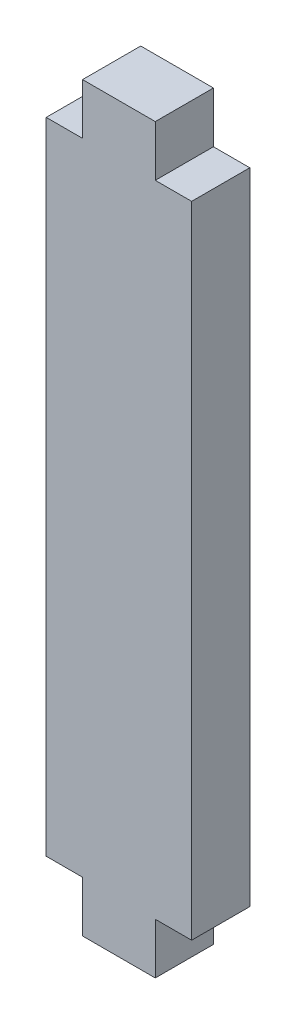
ISO-10303-21;
HEADER;
FILE_DESCRIPTION(('STEP AP214'),'2;1');
FILE_NAME('part.step','',(''),(''),'','','');
FILE_SCHEMA(('AUTOMOTIVE_DESIGN { 1 0 10303 214 1 1 1 1 }'));
ENDSEC;
DATA;
#1=APPLICATION_CONTEXT('core data for automotive mechanical design processes');
#2=APPLICATION_PROTOCOL_DEFINITION('international standard','automotive_design',2000,#1);
#3=PRODUCT_CONTEXT('',#1,'mechanical');
#4=PRODUCT('Part','Part','',(#3));
#5=PRODUCT_RELATED_PRODUCT_CATEGORY('part','',(#4));
#6=PRODUCT_DEFINITION_FORMATION('','',#4);
#7=PRODUCT_DEFINITION_CONTEXT('part definition',#1,'design');
#8=PRODUCT_DEFINITION('design','',#6,#7);
#9=PRODUCT_DEFINITION_SHAPE('','',#8);
#10=(LENGTH_UNIT() NAMED_UNIT(*) SI_UNIT(.MILLI.,.METRE.));
#11=(NAMED_UNIT(*) PLANE_ANGLE_UNIT() SI_UNIT($,.RADIAN.));
#12=(NAMED_UNIT(*) SI_UNIT($,.STERADIAN.) SOLID_ANGLE_UNIT());
#13=UNCERTAINTY_MEASURE_WITH_UNIT(LENGTH_MEASURE(1.E-05),#10,'distance_accuracy_value','');
#14=(GEOMETRIC_REPRESENTATION_CONTEXT(3) GLOBAL_UNCERTAINTY_ASSIGNED_CONTEXT((#13)) GLOBAL_UNIT_ASSIGNED_CONTEXT((#10,
#11,#12)) REPRESENTATION_CONTEXT('',''));
#15=CARTESIAN_POINT('',(0.,0.,0.));
#16=DIRECTION('',(0.,0.,1.));
#17=DIRECTION('',(1.,0.,0.));
#18=AXIS2_PLACEMENT_3D('',#15,#16,#17);
#19=CARTESIAN_POINT('',(2.5,22.,4.));
#20=DIRECTION('',(0.,-1.,0.));
#21=DIRECTION('',(0.,0.,-1.));
#22=AXIS2_PLACEMENT_3D('',#19,#20,#21);
#23=PLANE('',#22);
#24=DIRECTION('',(-1.,0.,0.));
#25=VECTOR('',#24,1.);
#26=CARTESIAN_POINT('',(2.5,22.,0.));
#27=LINE('',#26,#25);
#28=CARTESIAN_POINT('',(5.,22.,0.));
#29=VERTEX_POINT('',#28);
#30=CARTESIAN_POINT('',(2.5,22.,0.));
#31=VERTEX_POINT('',#30);
#32=EDGE_CURVE('E154',#29,#31,#27,.T.);
#33=ORIENTED_EDGE('',*,*,#32,.T.);
#34=DIRECTION('',(0.,0.,-1.));
#35=VECTOR('',#34,1.);
#36=CARTESIAN_POINT('',(2.5,22.,4.));
#37=LINE('',#36,#35);
#38=CARTESIAN_POINT('',(2.5,22.,4.));
#39=VERTEX_POINT('',#38);
#40=EDGE_CURVE('E11',#39,#31,#37,.T.);
#41=ORIENTED_EDGE('',*,*,#40,.F.);
#42=DIRECTION('',(-1.,0.,0.));
#43=VECTOR('',#42,1.);
#44=CARTESIAN_POINT('',(2.5,22.,4.));
#45=LINE('',#44,#43);
#46=CARTESIAN_POINT('',(5.,22.,4.));
#47=VERTEX_POINT('',#46);
#48=EDGE_CURVE('E176',#47,#39,#45,.T.);
#49=ORIENTED_EDGE('',*,*,#48,.F.);
#50=DIRECTION('',(0.,0.,-1.));
#51=VECTOR('',#50,1.);
#52=CARTESIAN_POINT('',(5.,22.,4.));
#53=LINE('',#52,#51);
#54=EDGE_CURVE('E150',#47,#29,#53,.T.);
#55=ORIENTED_EDGE('',*,*,#54,.T.);
#56=EDGE_LOOP('',(#33,#41,#49,#55));
#57=FACE_BOUND('',#56,.T.);
#58=ADVANCED_FACE('F34',(#57),#23,.F.);
#59=CARTESIAN_POINT('',(2.5,22.,4.));
#60=DIRECTION('',(-1.,0.,0.));
#61=DIRECTION('',(0.,0.,1.));
#62=AXIS2_PLACEMENT_3D('',#59,#60,#61);
#63=PLANE('',#62);
#64=DIRECTION('',(0.,1.,0.));
#65=VECTOR('',#64,1.);
#66=CARTESIAN_POINT('',(2.5,22.,0.));
#67=LINE('',#66,#65);
#68=CARTESIAN_POINT('',(2.5,25.5,0.));
#69=VERTEX_POINT('',#68);
#70=EDGE_CURVE('E157',#31,#69,#67,.T.);
#71=ORIENTED_EDGE('',*,*,#70,.T.);
#72=DIRECTION('',(0.,0.,-1.));
#73=VECTOR('',#72,1.);
#74=CARTESIAN_POINT('',(2.5,25.5,4.));
#75=LINE('',#74,#73);
#76=CARTESIAN_POINT('',(2.5,25.5,4.));
#77=VERTEX_POINT('',#76);
#78=EDGE_CURVE('E42',#77,#69,#75,.T.);
#79=ORIENTED_EDGE('',*,*,#78,.F.);
#80=DIRECTION('',(0.,1.,0.));
#81=VECTOR('',#80,1.);
#82=CARTESIAN_POINT('',(2.5,22.,4.));
#83=LINE('',#82,#81);
#84=EDGE_CURVE('E105',#39,#77,#83,.T.);
#85=ORIENTED_EDGE('',*,*,#84,.F.);
#86=ORIENTED_EDGE('',*,*,#40,.T.);
#87=EDGE_LOOP('',(#71,#79,#85,#86));
#88=FACE_BOUND('',#87,.T.);
#89=ADVANCED_FACE('F254',(#88),#63,.F.);
#90=CARTESIAN_POINT('',(2.5,25.5,4.));
#91=DIRECTION('',(0.,-1.,0.));
#92=DIRECTION('',(1.,0.,0.));
#93=AXIS2_PLACEMENT_3D('',#90,#91,#92);
#94=PLANE('',#93);
#95=DIRECTION('',(-1.,0.,0.));
#96=VECTOR('',#95,1.);
#97=CARTESIAN_POINT('',(2.5,25.5,0.));
#98=LINE('',#97,#96);
#99=CARTESIAN_POINT('',(-2.5,25.5,0.));
#100=VERTEX_POINT('',#99);
#101=EDGE_CURVE('E159',#69,#100,#98,.T.);
#102=ORIENTED_EDGE('',*,*,#101,.T.);
#103=DIRECTION('',(0.,0.,-1.));
#104=VECTOR('',#103,1.);
#105=CARTESIAN_POINT('',(-2.5,25.5,4.));
#106=LINE('',#105,#104);
#107=CARTESIAN_POINT('',(-2.5,25.5,4.));
#108=VERTEX_POINT('',#107);
#109=EDGE_CURVE('E195',#108,#100,#106,.T.);
#110=ORIENTED_EDGE('',*,*,#109,.F.);
#111=DIRECTION('',(-1.,0.,0.));
#112=VECTOR('',#111,1.);
#113=CARTESIAN_POINT('',(2.5,25.5,4.));
#114=LINE('',#113,#112);
#115=EDGE_CURVE('E203',#77,#108,#114,.T.);
#116=ORIENTED_EDGE('',*,*,#115,.F.);
#117=ORIENTED_EDGE('',*,*,#78,.T.);
#118=EDGE_LOOP('',(#102,#110,#116,#117));
#119=FACE_BOUND('',#118,.T.);
#120=ADVANCED_FACE('F201',(#119),#94,.F.);
#121=CARTESIAN_POINT('',(-2.5,25.5,4.));
#122=DIRECTION('',(1.,0.,0.));
#123=DIRECTION('',(0.,1.,0.));
#124=AXIS2_PLACEMENT_3D('',#121,#122,#123);
#125=PLANE('',#124);
#126=DIRECTION('',(0.,-1.,0.));
#127=VECTOR('',#126,1.);
#128=CARTESIAN_POINT('',(-2.5,25.5,0.));
#129=LINE('',#128,#127);
#130=CARTESIAN_POINT('',(-2.5,22.,0.));
#131=VERTEX_POINT('',#130);
#132=EDGE_CURVE('E161',#100,#131,#129,.T.);
#133=ORIENTED_EDGE('',*,*,#132,.T.);
#134=DIRECTION('',(0.,0.,-1.));
#135=VECTOR('',#134,1.);
#136=CARTESIAN_POINT('',(-2.5,22.,4.));
#137=LINE('',#136,#135);
#138=CARTESIAN_POINT('',(-2.5,22.,4.));
#139=VERTEX_POINT('',#138);
#140=EDGE_CURVE('E192',#139,#131,#137,.T.);
#141=ORIENTED_EDGE('',*,*,#140,.F.);
#142=DIRECTION('',(0.,-1.,0.));
#143=VECTOR('',#142,1.);
#144=CARTESIAN_POINT('',(-2.5,25.5,4.));
#145=LINE('',#144,#143);
#146=EDGE_CURVE('E221',#108,#139,#145,.T.);
#147=ORIENTED_EDGE('',*,*,#146,.F.);
#148=ORIENTED_EDGE('',*,*,#109,.T.);
#149=EDGE_LOOP('',(#133,#141,#147,#148));
#150=FACE_BOUND('',#149,.T.);
#151=ADVANCED_FACE('F212',(#150),#125,.F.);
#152=CARTESIAN_POINT('',(-5.,22.,4.));
#153=DIRECTION('',(0.,-1.,0.));
#154=DIRECTION('',(1.,0.,0.));
#155=AXIS2_PLACEMENT_3D('',#152,#153,#154);
#156=PLANE('',#155);
#157=DIRECTION('',(-1.,0.,0.));
#158=VECTOR('',#157,1.);
#159=CARTESIAN_POINT('',(-5.,22.,0.));
#160=LINE('',#159,#158);
#161=CARTESIAN_POINT('',(-5.,22.,0.));
#162=VERTEX_POINT('',#161);
#163=EDGE_CURVE('E163',#131,#162,#160,.T.);
#164=ORIENTED_EDGE('',*,*,#163,.T.);
#165=DIRECTION('',(0.,0.,-1.));
#166=VECTOR('',#165,1.);
#167=CARTESIAN_POINT('',(-5.,22.,4.));
#168=LINE('',#167,#166);
#169=CARTESIAN_POINT('',(-5.,22.,4.));
#170=VERTEX_POINT('',#169);
#171=EDGE_CURVE('E189',#170,#162,#168,.T.);
#172=ORIENTED_EDGE('',*,*,#171,.F.);
#173=DIRECTION('',(-1.,0.,0.));
#174=VECTOR('',#173,1.);
#175=CARTESIAN_POINT('',(-5.,22.,4.));
#176=LINE('',#175,#174);
#177=EDGE_CURVE('E218',#139,#170,#176,.T.);
#178=ORIENTED_EDGE('',*,*,#177,.F.);
#179=ORIENTED_EDGE('',*,*,#140,.T.);
#180=EDGE_LOOP('',(#164,#172,#178,#179));
#181=FACE_BOUND('',#180,.T.);
#182=ADVANCED_FACE('F216',(#181),#156,.F.);
#183=CARTESIAN_POINT('',(-5.,-22.,4.));
#184=DIRECTION('',(1.,0.,0.));
#185=DIRECTION('',(0.,0.,-1.));
#186=AXIS2_PLACEMENT_3D('',#183,#184,#185);
#187=PLANE('',#186);
#188=DIRECTION('',(0.,-1.,0.));
#189=VECTOR('',#188,1.);
#190=CARTESIAN_POINT('',(-5.,-22.,0.));
#191=LINE('',#190,#189);
#192=CARTESIAN_POINT('',(-5.,-22.,0.));
#193=VERTEX_POINT('',#192);
#194=EDGE_CURVE('E165',#162,#193,#191,.T.);
#195=ORIENTED_EDGE('',*,*,#194,.T.);
#196=DIRECTION('',(0.,0.,-1.));
#197=VECTOR('',#196,1.);
#198=CARTESIAN_POINT('',(-5.,-22.,4.));
#199=LINE('',#198,#197);
#200=CARTESIAN_POINT('',(-5.,-22.,4.));
#201=VERTEX_POINT('',#200);
#202=EDGE_CURVE('E186',#201,#193,#199,.T.);
#203=ORIENTED_EDGE('',*,*,#202,.F.);
#204=DIRECTION('',(0.,-1.,0.));
#205=VECTOR('',#204,1.);
#206=CARTESIAN_POINT('',(-5.,-22.,4.));
#207=LINE('',#206,#205);
#208=EDGE_CURVE('E220',#170,#201,#207,.T.);
#209=ORIENTED_EDGE('',*,*,#208,.F.);
#210=ORIENTED_EDGE('',*,*,#171,.T.);
#211=EDGE_LOOP('',(#195,#203,#209,#210));
#212=FACE_BOUND('',#211,.T.);
#213=ADVANCED_FACE('F267',(#212),#187,.F.);
#214=CARTESIAN_POINT('',(-5.,-22.,4.));
#215=DIRECTION('',(0.,1.,0.));
#216=DIRECTION('',(-1.,0.,0.));
#217=AXIS2_PLACEMENT_3D('',#214,#215,#216);
#218=PLANE('',#217);
#219=DIRECTION('',(1.,0.,0.));
#220=VECTOR('',#219,1.);
#221=CARTESIAN_POINT('',(-5.,-22.,0.));
#222=LINE('',#221,#220);
#223=CARTESIAN_POINT('',(-2.5,-22.,0.));
#224=VERTEX_POINT('',#223);
#225=EDGE_CURVE('E167',#193,#224,#222,.T.);
#226=ORIENTED_EDGE('',*,*,#225,.T.);
#227=DIRECTION('',(0.,0.,-1.));
#228=VECTOR('',#227,1.);
#229=CARTESIAN_POINT('',(-2.5,-22.,4.));
#230=LINE('',#229,#228);
#231=CARTESIAN_POINT('',(-2.5,-22.,4.));
#232=VERTEX_POINT('',#231);
#233=EDGE_CURVE('E183',#232,#224,#230,.T.);
#234=ORIENTED_EDGE('',*,*,#233,.F.);
#235=DIRECTION('',(1.,0.,0.));
#236=VECTOR('',#235,1.);
#237=CARTESIAN_POINT('',(-5.,-22.,4.));
#238=LINE('',#237,#236);
#239=EDGE_CURVE('E223',#201,#232,#238,.T.);
#240=ORIENTED_EDGE('',*,*,#239,.F.);
#241=ORIENTED_EDGE('',*,*,#202,.T.);
#242=EDGE_LOOP('',(#226,#234,#240,#241));
#243=FACE_BOUND('',#242,.T.);
#244=ADVANCED_FACE('F270',(#243),#218,.F.);
#245=CARTESIAN_POINT('',(-2.5,-25.5,4.));
#246=DIRECTION('',(1.,0.,0.));
#247=DIRECTION('',(0.,1.,0.));
#248=AXIS2_PLACEMENT_3D('',#245,#246,#247);
#249=PLANE('',#248);
#250=DIRECTION('',(0.,-1.,0.));
#251=VECTOR('',#250,1.);
#252=CARTESIAN_POINT('',(-2.5,-25.5,0.));
#253=LINE('',#252,#251);
#254=CARTESIAN_POINT('',(-2.5,-25.5,0.));
#255=VERTEX_POINT('',#254);
#256=EDGE_CURVE('E169',#224,#255,#253,.T.);
#257=ORIENTED_EDGE('',*,*,#256,.T.);
#258=DIRECTION('',(0.,0.,-1.));
#259=VECTOR('',#258,1.);
#260=CARTESIAN_POINT('',(-2.5,-25.5,4.));
#261=LINE('',#260,#259);
#262=CARTESIAN_POINT('',(-2.5,-25.5,4.));
#263=VERTEX_POINT('',#262);
#264=EDGE_CURVE('E180',#263,#255,#261,.T.);
#265=ORIENTED_EDGE('',*,*,#264,.F.);
#266=DIRECTION('',(0.,-1.,0.));
#267=VECTOR('',#266,1.);
#268=CARTESIAN_POINT('',(-2.5,-25.5,4.));
#269=LINE('',#268,#267);
#270=EDGE_CURVE('E229',#232,#263,#269,.T.);
#271=ORIENTED_EDGE('',*,*,#270,.F.);
#272=ORIENTED_EDGE('',*,*,#233,.T.);
#273=EDGE_LOOP('',(#257,#265,#271,#272));
#274=FACE_BOUND('',#273,.T.);
#275=ADVANCED_FACE('F235',(#274),#249,.F.);
#276=CARTESIAN_POINT('',(2.5,-25.5,4.));
#277=DIRECTION('',(0.,1.,0.));
#278=DIRECTION('',(0.,0.,1.));
#279=AXIS2_PLACEMENT_3D('',#276,#277,#278);
#280=PLANE('',#279);
#281=DIRECTION('',(1.,0.,0.));
#282=VECTOR('',#281,1.);
#283=CARTESIAN_POINT('',(2.5,-25.5,0.));
#284=LINE('',#283,#282);
#285=CARTESIAN_POINT('',(2.5,-25.5,0.));
#286=VERTEX_POINT('',#285);
#287=EDGE_CURVE('E171',#255,#286,#284,.T.);
#288=ORIENTED_EDGE('',*,*,#287,.T.);
#289=DIRECTION('',(0.,0.,-1.));
#290=VECTOR('',#289,1.);
#291=CARTESIAN_POINT('',(2.5,-25.5,4.));
#292=LINE('',#291,#290);
#293=CARTESIAN_POINT('',(2.5,-25.5,4.));
#294=VERTEX_POINT('',#293);
#295=EDGE_CURVE('E145',#294,#286,#292,.T.);
#296=ORIENTED_EDGE('',*,*,#295,.F.);
#297=DIRECTION('',(1.,0.,0.));
#298=VECTOR('',#297,1.);
#299=CARTESIAN_POINT('',(2.5,-25.5,4.));
#300=LINE('',#299,#298);
#301=EDGE_CURVE('E136',#263,#294,#300,.T.);
#302=ORIENTED_EDGE('',*,*,#301,.F.);
#303=ORIENTED_EDGE('',*,*,#264,.T.);
#304=EDGE_LOOP('',(#288,#296,#302,#303));
#305=FACE_BOUND('',#304,.T.);
#306=ADVANCED_FACE('F239',(#305),#280,.F.);
#307=CARTESIAN_POINT('',(2.5,-22.,4.));
#308=DIRECTION('',(-1.,0.,0.));
#309=DIRECTION('',(0.,-1.,0.));
#310=AXIS2_PLACEMENT_3D('',#307,#308,#309);
#311=PLANE('',#310);
#312=DIRECTION('',(0.,1.,0.));
#313=VECTOR('',#312,1.);
#314=CARTESIAN_POINT('',(2.5,-22.,0.));
#315=LINE('',#314,#313);
#316=CARTESIAN_POINT('',(2.5,-22.,0.));
#317=VERTEX_POINT('',#316);
#318=EDGE_CURVE('E144',#286,#317,#315,.T.);
#319=ORIENTED_EDGE('',*,*,#318,.T.);
#320=DIRECTION('',(0.,0.,-1.));
#321=VECTOR('',#320,1.);
#322=CARTESIAN_POINT('',(2.5,-22.,4.));
#323=LINE('',#322,#321);
#324=CARTESIAN_POINT('',(2.5,-22.,4.));
#325=VERTEX_POINT('',#324);
#326=EDGE_CURVE('E141',#325,#317,#323,.T.);
#327=ORIENTED_EDGE('',*,*,#326,.F.);
#328=DIRECTION('',(0.,1.,0.));
#329=VECTOR('',#328,1.);
#330=CARTESIAN_POINT('',(2.5,-22.,4.));
#331=LINE('',#330,#329);
#332=EDGE_CURVE('E130',#294,#325,#331,.T.);
#333=ORIENTED_EDGE('',*,*,#332,.F.);
#334=ORIENTED_EDGE('',*,*,#295,.T.);
#335=EDGE_LOOP('',(#319,#327,#333,#334));
#336=FACE_BOUND('',#335,.T.);
#337=ADVANCED_FACE('F142',(#336),#311,.F.);
#338=CARTESIAN_POINT('',(2.5,-22.,4.));
#339=DIRECTION('',(0.,1.,0.));
#340=DIRECTION('',(0.,0.,1.));
#341=AXIS2_PLACEMENT_3D('',#338,#339,#340);
#342=PLANE('',#341);
#343=DIRECTION('',(1.,0.,0.));
#344=VECTOR('',#343,1.);
#345=CARTESIAN_POINT('',(2.5,-22.,0.));
#346=LINE('',#345,#344);
#347=CARTESIAN_POINT('',(5.,-22.,0.));
#348=VERTEX_POINT('',#347);
#349=EDGE_CURVE('E91',#317,#348,#346,.T.);
#350=ORIENTED_EDGE('',*,*,#349,.T.);
#351=DIRECTION('',(0.,0.,-1.));
#352=VECTOR('',#351,1.);
#353=CARTESIAN_POINT('',(5.,-22.,4.));
#354=LINE('',#353,#352);
#355=CARTESIAN_POINT('',(5.,-22.,4.));
#356=VERTEX_POINT('',#355);
#357=EDGE_CURVE('E146',#356,#348,#354,.T.);
#358=ORIENTED_EDGE('',*,*,#357,.F.);
#359=DIRECTION('',(1.,0.,0.));
#360=VECTOR('',#359,1.);
#361=CARTESIAN_POINT('',(2.5,-22.,4.));
#362=LINE('',#361,#360);
#363=EDGE_CURVE('E134',#325,#356,#362,.T.);
#364=ORIENTED_EDGE('',*,*,#363,.F.);
#365=ORIENTED_EDGE('',*,*,#326,.T.);
#366=EDGE_LOOP('',(#350,#358,#364,#365));
#367=FACE_BOUND('',#366,.T.);
#368=ADVANCED_FACE('F148',(#367),#342,.F.);
#369=CARTESIAN_POINT('',(5.,-22.,4.));
#370=DIRECTION('',(-1.,0.,0.));
#371=DIRECTION('',(0.,0.,1.));
#372=AXIS2_PLACEMENT_3D('',#369,#370,#371);
#373=PLANE('',#372);
#374=DIRECTION('',(0.,1.,0.));
#375=VECTOR('',#374,1.);
#376=CARTESIAN_POINT('',(5.,-22.,0.));
#377=LINE('',#376,#375);
#378=EDGE_CURVE('E97',#348,#29,#377,.T.);
#379=ORIENTED_EDGE('',*,*,#378,.T.);
#380=ORIENTED_EDGE('',*,*,#54,.F.);
#381=DIRECTION('',(0.,1.,0.));
#382=VECTOR('',#381,1.);
#383=CARTESIAN_POINT('',(5.,-22.,4.));
#384=LINE('',#383,#382);
#385=EDGE_CURVE('E50',#356,#47,#384,.T.);
#386=ORIENTED_EDGE('',*,*,#385,.F.);
#387=ORIENTED_EDGE('',*,*,#357,.T.);
#388=EDGE_LOOP('',(#379,#380,#386,#387));
#389=FACE_BOUND('',#388,.T.);
#390=ADVANCED_FACE('F243',(#389),#373,.F.);
#391=CARTESIAN_POINT('',(0.,0.,4.));
#392=DIRECTION('',(0.,0.,1.));
#393=DIRECTION('',(1.,0.,0.));
#394=AXIS2_PLACEMENT_3D('',#391,#392,#393);
#395=PLANE('',#394);
#396=ORIENTED_EDGE('',*,*,#48,.T.);
#397=ORIENTED_EDGE('',*,*,#84,.T.);
#398=ORIENTED_EDGE('',*,*,#115,.T.);
#399=ORIENTED_EDGE('',*,*,#146,.T.);
#400=ORIENTED_EDGE('',*,*,#177,.T.);
#401=ORIENTED_EDGE('',*,*,#208,.T.);
#402=ORIENTED_EDGE('',*,*,#239,.T.);
#403=ORIENTED_EDGE('',*,*,#270,.T.);
#404=ORIENTED_EDGE('',*,*,#301,.T.);
#405=ORIENTED_EDGE('',*,*,#332,.T.);
#406=ORIENTED_EDGE('',*,*,#363,.T.);
#407=ORIENTED_EDGE('',*,*,#385,.T.);
#408=EDGE_LOOP('',(#396,#397,#398,#399,#400,#401,#402,#403,#404,#405,#406,#407));
#409=FACE_BOUND('',#408,.T.);
#410=ADVANCED_FACE('F132',(#409),#395,.T.);
#411=CARTESIAN_POINT('',(0.,0.,0.));
#412=DIRECTION('',(0.,0.,1.));
#413=DIRECTION('',(1.,0.,0.));
#414=AXIS2_PLACEMENT_3D('',#411,#412,#413);
#415=PLANE('',#414);
#416=ORIENTED_EDGE('',*,*,#32,.F.);
#417=ORIENTED_EDGE('',*,*,#378,.F.);
#418=ORIENTED_EDGE('',*,*,#349,.F.);
#419=ORIENTED_EDGE('',*,*,#318,.F.);
#420=ORIENTED_EDGE('',*,*,#287,.F.);
#421=ORIENTED_EDGE('',*,*,#256,.F.);
#422=ORIENTED_EDGE('',*,*,#225,.F.);
#423=ORIENTED_EDGE('',*,*,#194,.F.);
#424=ORIENTED_EDGE('',*,*,#163,.F.);
#425=ORIENTED_EDGE('',*,*,#132,.F.);
#426=ORIENTED_EDGE('',*,*,#101,.F.);
#427=ORIENTED_EDGE('',*,*,#70,.F.);
#428=EDGE_LOOP('',(#416,#417,#418,#419,#420,#421,#422,#423,#424,#425,#426,#427));
#429=FACE_BOUND('',#428,.T.);
#430=ADVANCED_FACE('F207',(#429),#415,.F.);
#431=CLOSED_SHELL('',(#58,#89,#120,#151,#182,#213,#244,#275,#306,#337,#368,#390,#410,#430));
#432=MANIFOLD_SOLID_BREP('B2',#431);
#433=ADVANCED_BREP_SHAPE_REPRESENTATION('',(#18,#432),#14);
#434=SHAPE_DEFINITION_REPRESENTATION(#9,#433);
ENDSEC;
END-ISO-10303-21;
